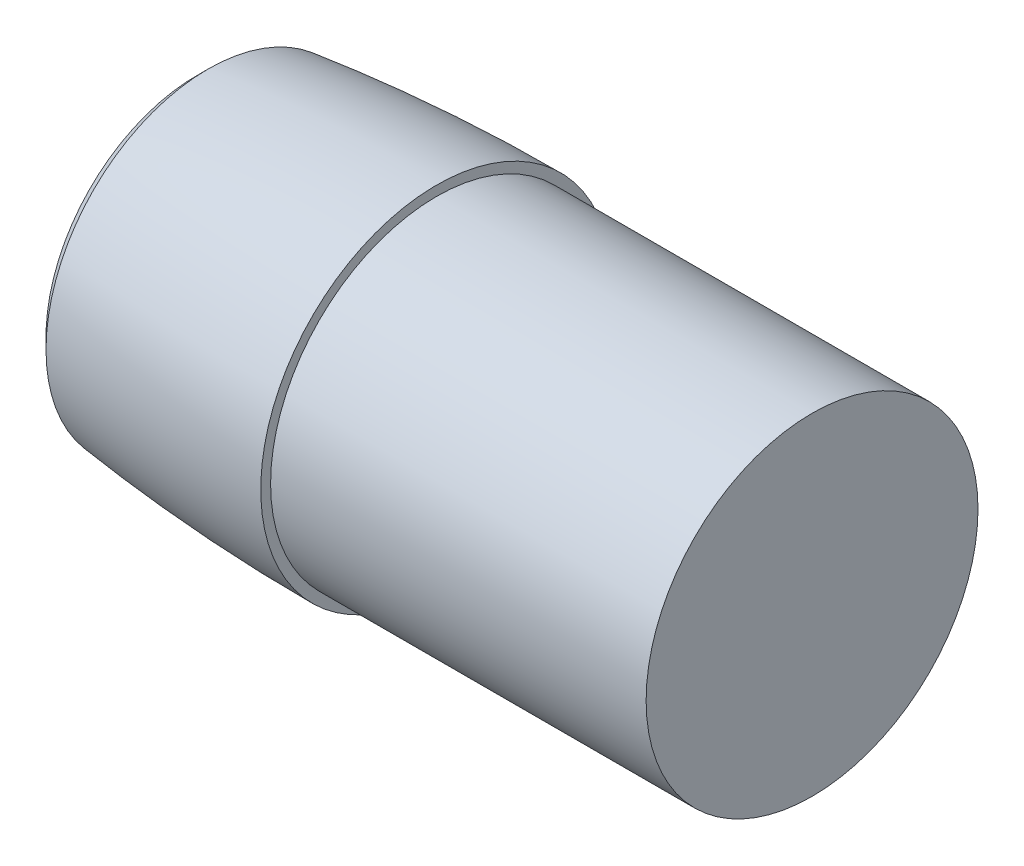
ISO-10303-21;
HEADER;
FILE_DESCRIPTION(('STEP AP214'),'2;1');
FILE_NAME('part.step','',(''),(''),'','','');
FILE_SCHEMA(('AUTOMOTIVE_DESIGN { 1 0 10303 214 1 1 1 1 }'));
ENDSEC;
DATA;
#1=APPLICATION_CONTEXT('core data for automotive mechanical design processes');
#2=APPLICATION_PROTOCOL_DEFINITION('international standard','automotive_design',2000,#1);
#3=PRODUCT_CONTEXT('',#1,'mechanical');
#4=PRODUCT('Part','Part','',(#3));
#5=PRODUCT_RELATED_PRODUCT_CATEGORY('part','',(#4));
#6=PRODUCT_DEFINITION_FORMATION('','',#4);
#7=PRODUCT_DEFINITION_CONTEXT('part definition',#1,'design');
#8=PRODUCT_DEFINITION('design','',#6,#7);
#9=PRODUCT_DEFINITION_SHAPE('','',#8);
#10=(LENGTH_UNIT() NAMED_UNIT(*) SI_UNIT(.MILLI.,.METRE.));
#11=(NAMED_UNIT(*) PLANE_ANGLE_UNIT() SI_UNIT($,.RADIAN.));
#12=(NAMED_UNIT(*) SI_UNIT($,.STERADIAN.) SOLID_ANGLE_UNIT());
#13=UNCERTAINTY_MEASURE_WITH_UNIT(LENGTH_MEASURE(1.E-05),#10,'distance_accuracy_value','');
#14=(GEOMETRIC_REPRESENTATION_CONTEXT(3) GLOBAL_UNCERTAINTY_ASSIGNED_CONTEXT((#13)) GLOBAL_UNIT_ASSIGNED_CONTEXT((#10,
#11,#12)) REPRESENTATION_CONTEXT('',''));
#15=CARTESIAN_POINT('',(0.,0.,0.));
#16=DIRECTION('',(0.,0.,1.));
#17=DIRECTION('',(1.,0.,0.));
#18=AXIS2_PLACEMENT_3D('',#15,#16,#17);
#19=CARTESIAN_POINT('',(-0.061536302764366,438.488079123923,0.));
#20=DIRECTION('',(-1.,0.,0.));
#21=DIRECTION('',(0.,0.,1.));
#22=AXIS2_PLACEMENT_3D('',#19,#20,#21);
#23=PLANE('',#22);
#24=CARTESIAN_POINT('',(-0.0615363027643978,398.238079123923,0.));
#25=DIRECTION('',(1.,0.,0.));
#26=DIRECTION('',(0.,0.,-1.));
#27=AXIS2_PLACEMENT_3D('',#24,#25,#26);
#28=CIRCLE('',#27,38.);
#29=CARTESIAN_POINT('',(-0.0615363027643978,398.238079123923,-38.));
#30=VERTEX_POINT('',#29);
#31=EDGE_CURVE('E65',#30,#30,#28,.T.);
#32=ORIENTED_EDGE('',*,*,#31,.F.);
#33=EDGE_LOOP('',(#32));
#34=FACE_BOUND('',#33,.T.);
#35=CARTESIAN_POINT('',(-0.0615363027643423,398.238079123923,0.));
#36=DIRECTION('',(1.,0.,0.));
#37=DIRECTION('',(0.,0.,-1.));
#38=AXIS2_PLACEMENT_3D('',#35,#36,#37);
#39=CIRCLE('',#38,40.2500000000001);
#40=CARTESIAN_POINT('',(-0.0615363027643423,398.238079123923,-40.2500000000001));
#41=VERTEX_POINT('',#40);
#42=EDGE_CURVE('E10',#41,#41,#39,.T.);
#43=ORIENTED_EDGE('',*,*,#42,.T.);
#44=EDGE_LOOP('',(#43));
#45=FACE_BOUND('',#44,.T.);
#46=ADVANCED_FACE('F37',(#34,#45),#23,.F.);
#47=CARTESIAN_POINT('',(0.,398.238079123923,0.));
#48=DIRECTION('',(1.,0.,0.));
#49=DIRECTION('',(0.,0.,-1.));
#50=AXIS2_PLACEMENT_3D('',#47,#48,#49);
#51=DEGENERATE_TOROIDAL_SURFACE('',#50,398.238079123923,438.488083441847,.F.);
#52=CARTESIAN_POINT('',(-52.3805942753835,398.238079123923,0.));
#53=DIRECTION('',(1.,0.,0.));
#54=DIRECTION('',(0.,0.,-1.));
#55=AXIS2_PLACEMENT_3D('',#52,#53,#54);
#56=CIRCLE('',#55,37.1101408837647);
#57=CARTESIAN_POINT('',(-52.3805942753835,398.238079123923,-37.1101408837647));
#58=VERTEX_POINT('',#57);
#59=EDGE_CURVE('E43',#58,#58,#56,.T.);
#60=ORIENTED_EDGE('',*,*,#59,.T.);
#61=EDGE_LOOP('',(#60));
#62=FACE_BOUND('',#61,.T.);
#63=ORIENTED_EDGE('',*,*,#42,.F.);
#64=EDGE_LOOP('',(#63));
#65=FACE_BOUND('',#64,.T.);
#66=ADVANCED_FACE('F72',(#62,#65),#51,.F.);
#67=CARTESIAN_POINT('',(-52.3805942753835,398.238079123923,0.));
#68=DIRECTION('',(1.,0.,0.));
#69=DIRECTION('',(0.,0.,-1.));
#70=AXIS2_PLACEMENT_3D('',#67,#68,#69);
#71=CONICAL_SURFACE('',#70,37.1101408837647,0.785398163397443);
#72=CARTESIAN_POINT('',(-54.9337549348475,398.238079123923,0.));
#73=DIRECTION('',(1.,0.,0.));
#74=DIRECTION('',(0.,0.,-1.));
#75=AXIS2_PLACEMENT_3D('',#72,#73,#74);
#76=CIRCLE('',#75,34.5569802243007);
#77=CARTESIAN_POINT('',(-54.9337549348475,398.238079123923,-34.5569802243007));
#78=VERTEX_POINT('',#77);
#79=EDGE_CURVE('E47',#78,#78,#76,.T.);
#80=ORIENTED_EDGE('',*,*,#79,.T.);
#81=EDGE_LOOP('',(#80));
#82=FACE_BOUND('',#81,.T.);
#83=ORIENTED_EDGE('',*,*,#59,.F.);
#84=EDGE_LOOP('',(#83));
#85=FACE_BOUND('',#84,.T.);
#86=ADVANCED_FACE('F76',(#82,#85),#71,.T.);
#87=CARTESIAN_POINT('',(0.,398.238079123923,0.));
#88=DIRECTION('',(1.,0.,0.));
#89=DIRECTION('',(0.,0.,-1.));
#90=AXIS2_PLACEMENT_3D('',#87,#88,#89);
#91=DEGENERATE_TOROIDAL_SURFACE('',#90,398.238079123923,436.267441860465,.F.);
#92=ORIENTED_EDGE('',*,*,#79,.F.);
#93=EDGE_LOOP('',(#92));
#94=FACE_BOUND('',#93,.T.);
#95=CARTESIAN_POINT('',(-5.0615363027644,398.238079123923,0.));
#96=DIRECTION('',(1.,0.,0.));
#97=DIRECTION('',(0.,0.,-1.));
#98=AXIS2_PLACEMENT_3D('',#95,#96,#97);
#99=CIRCLE('',#98,38.0000000000001);
#100=CARTESIAN_POINT('',(-5.0615363027644,398.238079123923,-38.0000000000001));
#101=VERTEX_POINT('',#100);
#102=EDGE_CURVE('E51',#101,#101,#99,.T.);
#103=ORIENTED_EDGE('',*,*,#102,.T.);
#104=EDGE_LOOP('',(#103));
#105=FACE_BOUND('',#104,.T.);
#106=ADVANCED_FACE('F80',(#94,#105),#91,.T.);
#107=CARTESIAN_POINT('',(-5.0615363027644,436.238079123923,0.));
#108=DIRECTION('',(-1.,0.,0.));
#109=DIRECTION('',(0.,0.,1.));
#110=AXIS2_PLACEMENT_3D('',#107,#108,#109);
#111=PLANE('',#110);
#112=CARTESIAN_POINT('',(-5.06153630276437,398.238079123923,0.));
#113=DIRECTION('',(1.,0.,0.));
#114=DIRECTION('',(0.,0.,-1.));
#115=AXIS2_PLACEMENT_3D('',#112,#113,#114);
#116=CIRCLE('',#115,33.);
#117=CARTESIAN_POINT('',(-5.06153630276437,398.238079123923,-33.));
#118=VERTEX_POINT('',#117);
#119=EDGE_CURVE('E56',#118,#118,#116,.T.);
#120=ORIENTED_EDGE('',*,*,#119,.T.);
#121=EDGE_LOOP('',(#120));
#122=FACE_BOUND('',#121,.T.);
#123=ORIENTED_EDGE('',*,*,#102,.F.);
#124=EDGE_LOOP('',(#123));
#125=FACE_BOUND('',#124,.T.);
#126=ADVANCED_FACE('F87',(#122,#125),#111,.T.);
#127=CARTESIAN_POINT('',(-190.061536302764,398.238079123923,0.));
#128=DIRECTION('',(1.,0.,0.));
#129=DIRECTION('',(0.,0.,-1.));
#130=AXIS2_PLACEMENT_3D('',#127,#128,#129);
#131=CYLINDRICAL_SURFACE('',#130,33.);
#132=CARTESIAN_POINT('',(80.9384636972356,398.238079123923,0.));
#133=DIRECTION('',(1.,0.,0.));
#134=DIRECTION('',(0.,0.,-1.));
#135=AXIS2_PLACEMENT_3D('',#132,#133,#134);
#136=CIRCLE('',#135,33.);
#137=CARTESIAN_POINT('',(80.9384636972356,398.238079123923,-33.));
#138=VERTEX_POINT('',#137);
#139=EDGE_CURVE('E59',#138,#138,#136,.T.);
#140=ORIENTED_EDGE('',*,*,#139,.T.);
#141=EDGE_LOOP('',(#140));
#142=FACE_BOUND('',#141,.T.);
#143=ORIENTED_EDGE('',*,*,#119,.F.);
#144=EDGE_LOOP('',(#143));
#145=FACE_BOUND('',#144,.T.);
#146=ADVANCED_FACE('F91',(#142,#145),#131,.F.);
#147=CARTESIAN_POINT('',(80.9384636972356,398.238079123923,0.));
#148=DIRECTION('',(1.,0.,0.));
#149=DIRECTION('',(0.,0.,-1.));
#150=AXIS2_PLACEMENT_3D('',#147,#148,#149);
#151=PLANE('',#150);
#152=ORIENTED_EDGE('',*,*,#139,.F.);
#153=EDGE_LOOP('',(#152));
#154=FACE_BOUND('',#153,.T.);
#155=ADVANCED_FACE('F95',(#154),#151,.F.);
#156=CARTESIAN_POINT('',(85.9384636972356,436.238079123923,0.));
#157=DIRECTION('',(-1.,0.,0.));
#158=DIRECTION('',(0.,0.,1.));
#159=AXIS2_PLACEMENT_3D('',#156,#157,#158);
#160=PLANE('',#159);
#161=CARTESIAN_POINT('',(85.9384636972356,398.238079123923,0.));
#162=DIRECTION('',(1.,0.,0.));
#163=DIRECTION('',(0.,0.,-1.));
#164=AXIS2_PLACEMENT_3D('',#161,#162,#163);
#165=CIRCLE('',#164,38.);
#166=CARTESIAN_POINT('',(85.9384636972356,398.238079123923,-38.));
#167=VERTEX_POINT('',#166);
#168=EDGE_CURVE('E62',#167,#167,#165,.T.);
#169=ORIENTED_EDGE('',*,*,#168,.T.);
#170=EDGE_LOOP('',(#169));
#171=FACE_BOUND('',#170,.T.);
#172=ADVANCED_FACE('F99',(#171),#160,.F.);
#173=CARTESIAN_POINT('',(-190.061536302764,398.238079123923,0.));
#174=DIRECTION('',(1.,0.,0.));
#175=DIRECTION('',(0.,0.,-1.));
#176=AXIS2_PLACEMENT_3D('',#173,#174,#175);
#177=CYLINDRICAL_SURFACE('',#176,38.);
#178=ORIENTED_EDGE('',*,*,#168,.F.);
#179=EDGE_LOOP('',(#178));
#180=FACE_BOUND('',#179,.T.);
#181=ORIENTED_EDGE('',*,*,#31,.T.);
#182=EDGE_LOOP('',(#181));
#183=FACE_BOUND('',#182,.T.);
#184=ADVANCED_FACE('F69',(#180,#183),#177,.T.);
#185=CLOSED_SHELL('',(#46,#66,#86,#106,#126,#146,#155,#172,#184));
#186=MANIFOLD_SOLID_BREP('B2',#185);
#187=ADVANCED_BREP_SHAPE_REPRESENTATION('',(#18,#186),#14);
#188=SHAPE_DEFINITION_REPRESENTATION(#9,#187);
ENDSEC;
END-ISO-10303-21;
